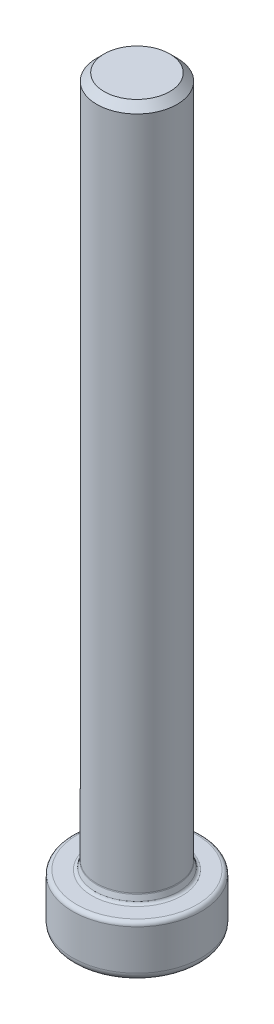
ISO-10303-21;
HEADER;
FILE_DESCRIPTION(('STEP AP214'),'2;1');
FILE_NAME('part.step','',(''),(''),'','','');
FILE_SCHEMA(('AUTOMOTIVE_DESIGN { 1 0 10303 214 1 1 1 1 }'));
ENDSEC;
DATA;
#1=APPLICATION_CONTEXT('core data for automotive mechanical design processes');
#2=APPLICATION_PROTOCOL_DEFINITION('international standard','automotive_design',2000,#1);
#3=PRODUCT_CONTEXT('',#1,'mechanical');
#4=PRODUCT('Part','Part','',(#3));
#5=PRODUCT_RELATED_PRODUCT_CATEGORY('part','',(#4));
#6=PRODUCT_DEFINITION_FORMATION('','',#4);
#7=PRODUCT_DEFINITION_CONTEXT('part definition',#1,'design');
#8=PRODUCT_DEFINITION('design','',#6,#7);
#9=PRODUCT_DEFINITION_SHAPE('','',#8);
#10=(LENGTH_UNIT() NAMED_UNIT(*) SI_UNIT(.MILLI.,.METRE.));
#11=(NAMED_UNIT(*) PLANE_ANGLE_UNIT() SI_UNIT($,.RADIAN.));
#12=(NAMED_UNIT(*) SI_UNIT($,.STERADIAN.) SOLID_ANGLE_UNIT());
#13=UNCERTAINTY_MEASURE_WITH_UNIT(LENGTH_MEASURE(1.E-05),#10,'distance_accuracy_value','');
#14=(GEOMETRIC_REPRESENTATION_CONTEXT(3) GLOBAL_UNCERTAINTY_ASSIGNED_CONTEXT((#13)) GLOBAL_UNIT_ASSIGNED_CONTEXT((#10,
#11,#12)) REPRESENTATION_CONTEXT('',''));
#15=CARTESIAN_POINT('',(0.,0.,0.));
#16=DIRECTION('',(0.,0.,1.));
#17=DIRECTION('',(1.,0.,0.));
#18=AXIS2_PLACEMENT_3D('',#15,#16,#17);
#19=CARTESIAN_POINT('',(-30.0499584026354,-27.5,-11.));
#20=DIRECTION('',(0.,1.,0.));
#21=DIRECTION('',(0.,0.,-1.));
#22=AXIS2_PLACEMENT_3D('',#19,#20,#21);
#23=CYLINDRICAL_SURFACE('',#22,5.);
#24=CARTESIAN_POINT('',(-30.0499584026354,12.58,-11.));
#25=DIRECTION('',(0.,1.,0.));
#26=DIRECTION('',(0.,0.,-1.));
#27=AXIS2_PLACEMENT_3D('',#24,#25,#26);
#28=CIRCLE('',#27,5.);
#29=CARTESIAN_POINT('',(-30.0499584026354,12.58,-16.));
#30=VERTEX_POINT('',#29);
#31=CARTESIAN_POINT('',(-30.0499584026355,12.58,-6.));
#32=VERTEX_POINT('',#31);
#33=EDGE_CURVE('E217',#30,#32,#28,.T.);
#34=ORIENTED_EDGE('',*,*,#33,.F.);
#35=CARTESIAN_POINT('',(-30.0499584026354,12.58,-11.));
#36=DIRECTION('',(0.,1.,0.));
#37=DIRECTION('',(0.,0.,-1.));
#38=AXIS2_PLACEMENT_3D('',#35,#36,#37);
#39=CIRCLE('',#38,5.);
#40=EDGE_CURVE('E228',#32,#30,#39,.T.);
#41=ORIENTED_EDGE('',*,*,#40,.F.);
#42=DIRECTION('',(0.,-1.,0.));
#43=VECTOR('',#42,1.);
#44=CARTESIAN_POINT('',(-30.0499584026354,-27.5,-6.));
#45=LINE('',#44,#43);
#46=CARTESIAN_POINT('',(-30.0499584026354,-71.48,-6.));
#47=VERTEX_POINT('',#46);
#48=EDGE_CURVE('E11',#32,#47,#45,.T.);
#49=ORIENTED_EDGE('',*,*,#48,.T.);
#50=CARTESIAN_POINT('',(-30.0499584026354,-71.48,-11.));
#51=DIRECTION('',(0.,-1.,0.));
#52=DIRECTION('',(0.,0.,-1.));
#53=AXIS2_PLACEMENT_3D('',#50,#51,#52);
#54=CIRCLE('',#53,5.);
#55=CARTESIAN_POINT('',(-25.0499584026354,-71.48,-11.));
#56=VERTEX_POINT('',#55);
#57=EDGE_CURVE('E302',#56,#47,#54,.T.);
#58=ORIENTED_EDGE('',*,*,#57,.F.);
#59=CARTESIAN_POINT('',(-30.0499584026354,-71.48,-11.));
#60=DIRECTION('',(0.,-1.,0.));
#61=DIRECTION('',(0.,0.,-1.));
#62=AXIS2_PLACEMENT_3D('',#59,#60,#61);
#63=CIRCLE('',#62,5.);
#64=EDGE_CURVE('E289',#47,#56,#63,.T.);
#65=ORIENTED_EDGE('',*,*,#64,.F.);
#66=ORIENTED_EDGE('',*,*,#48,.F.);
#67=EDGE_LOOP('',(#34,#41,#49,#58,#65,#66));
#68=FACE_BOUND('',#67,.T.);
#69=ADVANCED_FACE('F17',(#68),#23,.T.);
#70=CARTESIAN_POINT('',(-30.0499584026354,12.58,-11.));
#71=DIRECTION('',(0.,-1.,0.));
#72=DIRECTION('',(0.,0.,1.));
#73=AXIS2_PLACEMENT_3D('',#70,#71,#72);
#74=CONICAL_SURFACE('',#73,5.,0.78539816339745);
#75=ORIENTED_EDGE('',*,*,#33,.T.);
#76=ORIENTED_EDGE('',*,*,#40,.T.);
#77=DIRECTION('',(0.,0.707106781186546,0.707106781186549));
#78=VECTOR('',#77,1.);
#79=CARTESIAN_POINT('',(-30.0499584026354,12.58,-16.));
#80=LINE('',#79,#78);
#81=CARTESIAN_POINT('',(-30.0499584026354,13.5,-15.08));
#82=VERTEX_POINT('',#81);
#83=EDGE_CURVE('E25',#30,#82,#80,.T.);
#84=ORIENTED_EDGE('',*,*,#83,.T.);
#85=CARTESIAN_POINT('',(-30.0499584026354,13.5,-11.));
#86=DIRECTION('',(0.,1.,0.));
#87=DIRECTION('',(0.,0.,-1.));
#88=AXIS2_PLACEMENT_3D('',#85,#86,#87);
#89=CIRCLE('',#88,4.08);
#90=EDGE_CURVE('E214',#82,#82,#89,.T.);
#91=ORIENTED_EDGE('',*,*,#90,.F.);
#92=ORIENTED_EDGE('',*,*,#83,.F.);
#93=EDGE_LOOP('',(#75,#76,#84,#91,#92));
#94=FACE_BOUND('',#93,.T.);
#95=ADVANCED_FACE('F319',(#94),#74,.T.);
#96=CARTESIAN_POINT('',(-30.0499584026354,13.5,-15.08));
#97=DIRECTION('',(0.,-1.,0.));
#98=DIRECTION('',(0.,0.,-1.));
#99=AXIS2_PLACEMENT_3D('',#96,#97,#98);
#100=PLANE('',#99);
#101=ORIENTED_EDGE('',*,*,#90,.T.);
#102=EDGE_LOOP('',(#101));
#103=FACE_BOUND('',#102,.T.);
#104=ADVANCED_FACE('F321',(#103),#100,.F.);
#105=CARTESIAN_POINT('',(-30.0499584026354,-72.1,-11.));
#106=DIRECTION('',(0.,1.,0.));
#107=DIRECTION('',(-1.,0.,0.));
#108=AXIS2_PLACEMENT_3D('',#105,#106,#107);
#109=TOROIDAL_SURFACE('',#108,5.6,0.4);
#110=CARTESIAN_POINT('',(-30.0499584026354,-72.2228011119691,-11.));
#111=DIRECTION('',(0.,1.,0.));
#112=DIRECTION('',(-1.,0.,0.));
#113=AXIS2_PLACEMENT_3D('',#110,#111,#112);
#114=CIRCLE('',#113,5.21931655289578);
#115=CARTESIAN_POINT('',(-35.2692749555312,-72.2228011119691,-11.));
#116=VERTEX_POINT('',#115);
#117=CARTESIAN_POINT('',(-24.8306418497397,-72.2228011119691,-11.));
#118=VERTEX_POINT('',#117);
#119=EDGE_CURVE('E306',#116,#118,#114,.T.);
#120=ORIENTED_EDGE('',*,*,#119,.F.);
#121=CARTESIAN_POINT('',(-30.0499584026354,-72.2228011119691,-11.));
#122=DIRECTION('',(0.,1.,0.));
#123=DIRECTION('',(-1.,0.,0.));
#124=AXIS2_PLACEMENT_3D('',#121,#122,#123);
#125=CIRCLE('',#124,5.21931655289578);
#126=EDGE_CURVE('E310',#118,#116,#125,.T.);
#127=ORIENTED_EDGE('',*,*,#126,.F.);
#128=CARTESIAN_POINT('',(-24.4499584026354,-72.1,-11.));
#129=DIRECTION('',(0.,0.,1.));
#130=DIRECTION('',(1.,0.,0.));
#131=AXIS2_PLACEMENT_3D('',#128,#129,#130);
#132=CIRCLE('',#131,0.4);
#133=CARTESIAN_POINT('',(-24.4499584026354,-72.5,-11.));
#134=VERTEX_POINT('',#133);
#135=EDGE_CURVE('E218',#118,#134,#132,.T.);
#136=ORIENTED_EDGE('',*,*,#135,.T.);
#137=CARTESIAN_POINT('',(-30.0499584026354,-72.5,-11.));
#138=DIRECTION('',(0.,-1.,0.));
#139=DIRECTION('',(0.,0.,1.));
#140=AXIS2_PLACEMENT_3D('',#137,#138,#139);
#141=CIRCLE('',#140,5.6);
#142=EDGE_CURVE('E393',#134,#134,#141,.T.);
#143=ORIENTED_EDGE('',*,*,#142,.F.);
#144=ORIENTED_EDGE('',*,*,#135,.F.);
#145=EDGE_LOOP('',(#120,#127,#136,#143,#144));
#146=FACE_BOUND('',#145,.T.);
#147=ADVANCED_FACE('F323',(#146),#109,.F.);
#148=CARTESIAN_POINT('',(-30.0499584026354,-71.6028011119691,-11.));
#149=DIRECTION('',(0.,-1.,0.));
#150=DIRECTION('',(1.,0.,0.));
#151=AXIS2_PLACEMENT_3D('',#148,#149,#150);
#152=CONICAL_SURFACE('',#151,5.01931655289578,0.312042121562536);
#153=ORIENTED_EDGE('',*,*,#119,.T.);
#154=ORIENTED_EDGE('',*,*,#126,.T.);
#155=DIRECTION('',(0.307002779922761,0.95170861776055,0.));
#156=VECTOR('',#155,1.);
#157=CARTESIAN_POINT('',(-35.0692749555312,-71.6028011119691,-11.));
#158=LINE('',#157,#156);
#159=CARTESIAN_POINT('',(-35.0692749555312,-71.6028011119691,-11.));
#160=VERTEX_POINT('',#159);
#161=EDGE_CURVE('E251',#116,#160,#158,.T.);
#162=ORIENTED_EDGE('',*,*,#161,.T.);
#163=CARTESIAN_POINT('',(-30.0499584026354,-71.6028011119691,-11.));
#164=DIRECTION('',(0.,1.,0.));
#165=DIRECTION('',(-1.,0.,0.));
#166=AXIS2_PLACEMENT_3D('',#163,#164,#165);
#167=CIRCLE('',#166,5.01931655289578);
#168=CARTESIAN_POINT('',(-25.0306418497397,-71.6028011119691,-11.));
#169=VERTEX_POINT('',#168);
#170=EDGE_CURVE('E295',#169,#160,#167,.T.);
#171=ORIENTED_EDGE('',*,*,#170,.F.);
#172=CARTESIAN_POINT('',(-30.0499584026354,-71.6028011119691,-11.));
#173=DIRECTION('',(0.,1.,0.));
#174=DIRECTION('',(-1.,0.,0.));
#175=AXIS2_PLACEMENT_3D('',#172,#173,#174);
#176=CIRCLE('',#175,5.01931655289578);
#177=EDGE_CURVE('E299',#160,#169,#176,.T.);
#178=ORIENTED_EDGE('',*,*,#177,.F.);
#179=ORIENTED_EDGE('',*,*,#161,.F.);
#180=EDGE_LOOP('',(#153,#154,#162,#171,#178,#179));
#181=FACE_BOUND('',#180,.T.);
#182=ADVANCED_FACE('F330',(#181),#152,.T.);
#183=CARTESIAN_POINT('',(-30.0499584026354,-71.48,-11.));
#184=DIRECTION('',(0.,1.,0.));
#185=DIRECTION('',(-1.,0.,0.));
#186=AXIS2_PLACEMENT_3D('',#183,#184,#185);
#187=TOROIDAL_SURFACE('',#186,5.4,0.4);
#188=ORIENTED_EDGE('',*,*,#64,.T.);
#189=CARTESIAN_POINT('',(-24.6499584026354,-71.48,-11.));
#190=DIRECTION('',(0.,0.,1.));
#191=DIRECTION('',(1.,0.,0.));
#192=AXIS2_PLACEMENT_3D('',#189,#190,#191);
#193=CIRCLE('',#192,0.4);
#194=EDGE_CURVE('E294',#56,#169,#193,.T.);
#195=ORIENTED_EDGE('',*,*,#194,.T.);
#196=ORIENTED_EDGE('',*,*,#170,.T.);
#197=ORIENTED_EDGE('',*,*,#177,.T.);
#198=ORIENTED_EDGE('',*,*,#194,.F.);
#199=ORIENTED_EDGE('',*,*,#57,.T.);
#200=EDGE_LOOP('',(#188,#195,#196,#197,#198,#199));
#201=FACE_BOUND('',#200,.T.);
#202=ADVANCED_FACE('F338',(#201),#187,.F.);
#203=CARTESIAN_POINT('',(-30.0499584026354,-75.5,-11.));
#204=DIRECTION('',(0.,-1.,0.));
#205=DIRECTION('',(0.,0.,1.));
#206=AXIS2_PLACEMENT_3D('',#203,#204,#205);
#207=CONICAL_SURFACE('',#206,4.,1.0471975511966);
#208=CARTESIAN_POINT('',(-30.0499584026354,-74.6339745962156,-11.));
#209=DIRECTION('',(0.,1.,0.));
#210=DIRECTION('',(0.,0.,-1.));
#211=AXIS2_PLACEMENT_3D('',#208,#209,#210);
#212=CIRCLE('',#211,2.5);
#213=CARTESIAN_POINT('',(-30.0499584026354,-74.6339745962156,-13.5));
#214=VERTEX_POINT('',#213);
#215=CARTESIAN_POINT('',(-30.0499584026354,-74.6339745962156,-8.5));
#216=VERTEX_POINT('',#215);
#217=EDGE_CURVE('E281',#214,#216,#212,.T.);
#218=ORIENTED_EDGE('',*,*,#217,.T.);
#219=CARTESIAN_POINT('',(-30.0499584026354,-74.6339745962156,-11.));
#220=DIRECTION('',(0.,1.,0.));
#221=DIRECTION('',(0.,0.,-1.));
#222=AXIS2_PLACEMENT_3D('',#219,#220,#221);
#223=CIRCLE('',#222,2.5);
#224=EDGE_CURVE('E285',#216,#214,#223,.T.);
#225=ORIENTED_EDGE('',*,*,#224,.T.);
#226=DIRECTION('',(0.,-0.5,-0.86602540378444));
#227=VECTOR('',#226,1.);
#228=CARTESIAN_POINT('',(-30.0499584026354,-75.5,-15.));
#229=LINE('',#228,#227);
#230=CARTESIAN_POINT('',(-30.0499584026354,-75.5,-15.));
#231=VERTEX_POINT('',#230);
#232=EDGE_CURVE('E286',#214,#231,#229,.T.);
#233=ORIENTED_EDGE('',*,*,#232,.T.);
#234=CARTESIAN_POINT('',(-30.0499584026354,-75.5,-11.));
#235=DIRECTION('',(0.,1.,0.));
#236=DIRECTION('',(-1.,0.,0.));
#237=AXIS2_PLACEMENT_3D('',#234,#235,#236);
#238=CIRCLE('',#237,4.);
#239=CARTESIAN_POINT('',(-26.5858567874977,-75.5,-13.));
#240=VERTEX_POINT('',#239);
#241=EDGE_CURVE('E256',#240,#231,#238,.T.);
#242=ORIENTED_EDGE('',*,*,#241,.F.);
#243=CARTESIAN_POINT('',(-30.0499584026354,-75.5,-11.));
#244=DIRECTION('',(0.,1.,0.));
#245=DIRECTION('',(-1.,0.,0.));
#246=AXIS2_PLACEMENT_3D('',#243,#244,#245);
#247=CIRCLE('',#246,4.);
#248=CARTESIAN_POINT('',(-26.5858567874977,-75.5,-9.));
#249=VERTEX_POINT('',#248);
#250=EDGE_CURVE('E186',#249,#240,#247,.T.);
#251=ORIENTED_EDGE('',*,*,#250,.F.);
#252=CARTESIAN_POINT('',(-30.0499584026354,-75.5,-11.));
#253=DIRECTION('',(0.,1.,0.));
#254=DIRECTION('',(-1.,0.,0.));
#255=AXIS2_PLACEMENT_3D('',#252,#253,#254);
#256=CIRCLE('',#255,4.);
#257=CARTESIAN_POINT('',(-30.0499584026354,-75.5,-7.));
#258=VERTEX_POINT('',#257);
#259=EDGE_CURVE('E275',#258,#249,#256,.T.);
#260=ORIENTED_EDGE('',*,*,#259,.F.);
#261=CARTESIAN_POINT('',(-30.0499584026354,-75.5,-11.));
#262=DIRECTION('',(0.,1.,0.));
#263=DIRECTION('',(-1.,0.,0.));
#264=AXIS2_PLACEMENT_3D('',#261,#262,#263);
#265=CIRCLE('',#264,4.);
#266=CARTESIAN_POINT('',(-33.5140600177732,-75.5,-9.));
#267=VERTEX_POINT('',#266);
#268=EDGE_CURVE('E271',#267,#258,#265,.T.);
#269=ORIENTED_EDGE('',*,*,#268,.F.);
#270=CARTESIAN_POINT('',(-30.0499584026354,-75.5,-11.));
#271=DIRECTION('',(0.,1.,0.));
#272=DIRECTION('',(-1.,0.,0.));
#273=AXIS2_PLACEMENT_3D('',#270,#271,#272);
#274=CIRCLE('',#273,4.);
#275=CARTESIAN_POINT('',(-33.5140600177732,-75.5,-13.));
#276=VERTEX_POINT('',#275);
#277=EDGE_CURVE('E267',#276,#267,#274,.T.);
#278=ORIENTED_EDGE('',*,*,#277,.F.);
#279=CARTESIAN_POINT('',(-30.0499584026354,-75.5,-11.));
#280=DIRECTION('',(0.,1.,0.));
#281=DIRECTION('',(-1.,0.,0.));
#282=AXIS2_PLACEMENT_3D('',#279,#280,#281);
#283=CIRCLE('',#282,4.);
#284=EDGE_CURVE('E263',#231,#276,#283,.T.);
#285=ORIENTED_EDGE('',*,*,#284,.F.);
#286=ORIENTED_EDGE('',*,*,#232,.F.);
#287=EDGE_LOOP('',(#218,#225,#233,#242,#251,#260,#269,#278,#285,#286));
#288=FACE_BOUND('',#287,.T.);
#289=ADVANCED_FACE('F511',(#288),#207,.F.);
#290=CARTESIAN_POINT('',(-30.0499584026354,-71.5,-11.));
#291=DIRECTION('',(0.,1.,0.));
#292=DIRECTION('',(0.,0.,-1.));
#293=AXIS2_PLACEMENT_3D('',#290,#291,#292);
#294=CYLINDRICAL_SURFACE('',#293,2.5);
#295=ORIENTED_EDGE('',*,*,#217,.F.);
#296=ORIENTED_EDGE('',*,*,#224,.F.);
#297=DIRECTION('',(0.,1.,0.));
#298=VECTOR('',#297,1.);
#299=CARTESIAN_POINT('',(-30.0499584026354,-71.5,-8.5));
#300=LINE('',#299,#298);
#301=CARTESIAN_POINT('',(-30.0499584026354,-71.5,-8.5));
#302=VERTEX_POINT('',#301);
#303=EDGE_CURVE('E290',#216,#302,#300,.T.);
#304=ORIENTED_EDGE('',*,*,#303,.T.);
#305=CARTESIAN_POINT('',(-30.0499584026354,-71.5,-11.));
#306=DIRECTION('',(0.,1.,0.));
#307=DIRECTION('',(0.,0.,-1.));
#308=AXIS2_PLACEMENT_3D('',#305,#306,#307);
#309=CIRCLE('',#308,2.5);
#310=EDGE_CURVE('E260',#302,#302,#309,.T.);
#311=ORIENTED_EDGE('',*,*,#310,.T.);
#312=ORIENTED_EDGE('',*,*,#303,.F.);
#313=EDGE_LOOP('',(#295,#296,#304,#311,#312));
#314=FACE_BOUND('',#313,.T.);
#315=ADVANCED_FACE('F585',(#314),#294,.F.);
#316=CARTESIAN_POINT('',(-32.5499584026354,-71.5,-11.));
#317=DIRECTION('',(0.,-1.,0.));
#318=DIRECTION('',(0.,0.,-1.));
#319=AXIS2_PLACEMENT_3D('',#316,#317,#318);
#320=PLANE('',#319);
#321=ORIENTED_EDGE('',*,*,#310,.F.);
#322=EDGE_LOOP('',(#321));
#323=FACE_BOUND('',#322,.T.);
#324=ADVANCED_FACE('F582',(#323),#320,.T.);
#325=CARTESIAN_POINT('',(-30.0499584026354,-75.5,-11.));
#326=DIRECTION('',(0.,1.,0.));
#327=DIRECTION('',(1.,0.,0.));
#328=AXIS2_PLACEMENT_3D('',#325,#326,#327);
#329=PLANE('',#328);
#330=ORIENTED_EDGE('',*,*,#241,.T.);
#331=DIRECTION('',(-1.,0.,0.));
#332=VECTOR('',#331,1.);
#333=CARTESIAN_POINT('',(-27.7405573258769,-75.5,-15.));
#334=LINE('',#333,#332);
#335=CARTESIAN_POINT('',(-27.7405573258769,-75.5,-15.));
#336=VERTEX_POINT('',#335);
#337=EDGE_CURVE('E220',#336,#231,#334,.T.);
#338=ORIENTED_EDGE('',*,*,#337,.F.);
#339=DIRECTION('',(-0.5,0.,-0.866025403784439));
#340=VECTOR('',#339,1.);
#341=CARTESIAN_POINT('',(-25.4311562491184,-75.5,-11.));
#342=LINE('',#341,#340);
#343=EDGE_CURVE('E191',#240,#336,#342,.T.);
#344=ORIENTED_EDGE('',*,*,#343,.F.);
#345=EDGE_LOOP('',(#330,#338,#344));
#346=FACE_BOUND('',#345,.T.);
#347=ADVANCED_FACE('F514',(#346),#329,.F.);
#348=CARTESIAN_POINT('',(-30.0499584026354,-75.5,-11.));
#349=DIRECTION('',(0.,1.,0.));
#350=DIRECTION('',(1.,0.,0.));
#351=AXIS2_PLACEMENT_3D('',#348,#349,#350);
#352=PLANE('',#351);
#353=ORIENTED_EDGE('',*,*,#250,.T.);
#354=DIRECTION('',(-0.5,0.,-0.866025403784439));
#355=VECTOR('',#354,1.);
#356=CARTESIAN_POINT('',(-25.4311562491184,-75.5,-11.));
#357=LINE('',#356,#355);
#358=CARTESIAN_POINT('',(-25.4311562491184,-75.5,-11.));
#359=VERTEX_POINT('',#358);
#360=EDGE_CURVE('E180',#359,#240,#357,.T.);
#361=ORIENTED_EDGE('',*,*,#360,.F.);
#362=DIRECTION('',(0.5,0.,-0.866025403784439));
#363=VECTOR('',#362,1.);
#364=CARTESIAN_POINT('',(-27.7405573258769,-75.5,-7.));
#365=LINE('',#364,#363);
#366=EDGE_CURVE('E184',#249,#359,#365,.T.);
#367=ORIENTED_EDGE('',*,*,#366,.F.);
#368=EDGE_LOOP('',(#353,#361,#367));
#369=FACE_BOUND('',#368,.T.);
#370=ADVANCED_FACE('F182',(#369),#352,.F.);
#371=CARTESIAN_POINT('',(-30.0499584026354,-75.5,-11.));
#372=DIRECTION('',(0.,1.,0.));
#373=DIRECTION('',(1.,0.,0.));
#374=AXIS2_PLACEMENT_3D('',#371,#372,#373);
#375=PLANE('',#374);
#376=ORIENTED_EDGE('',*,*,#259,.T.);
#377=DIRECTION('',(0.5,0.,-0.866025403784439));
#378=VECTOR('',#377,1.);
#379=CARTESIAN_POINT('',(-27.7405573258769,-75.5,-7.));
#380=LINE('',#379,#378);
#381=CARTESIAN_POINT('',(-27.7405573258769,-75.5,-7.));
#382=VERTEX_POINT('',#381);
#383=EDGE_CURVE('E205',#382,#249,#380,.T.);
#384=ORIENTED_EDGE('',*,*,#383,.F.);
#385=DIRECTION('',(1.,0.,0.));
#386=VECTOR('',#385,1.);
#387=CARTESIAN_POINT('',(-32.3593594793939,-75.5,-7.));
#388=LINE('',#387,#386);
#389=EDGE_CURVE('E462',#258,#382,#388,.T.);
#390=ORIENTED_EDGE('',*,*,#389,.F.);
#391=EDGE_LOOP('',(#376,#384,#390));
#392=FACE_BOUND('',#391,.T.);
#393=ADVANCED_FACE('F510',(#392),#375,.F.);
#394=CARTESIAN_POINT('',(-30.0499584026354,-75.5,-11.));
#395=DIRECTION('',(0.,1.,0.));
#396=DIRECTION('',(1.,0.,0.));
#397=AXIS2_PLACEMENT_3D('',#394,#395,#396);
#398=PLANE('',#397);
#399=ORIENTED_EDGE('',*,*,#268,.T.);
#400=DIRECTION('',(1.,0.,0.));
#401=VECTOR('',#400,1.);
#402=CARTESIAN_POINT('',(-32.3593594793939,-75.5,-7.));
#403=LINE('',#402,#401);
#404=CARTESIAN_POINT('',(-32.3593594793939,-75.5,-7.));
#405=VERTEX_POINT('',#404);
#406=EDGE_CURVE('E458',#405,#258,#403,.T.);
#407=ORIENTED_EDGE('',*,*,#406,.F.);
#408=DIRECTION('',(0.5,0.,0.866025403784439));
#409=VECTOR('',#408,1.);
#410=CARTESIAN_POINT('',(-34.6687605561524,-75.5,-11.));
#411=LINE('',#410,#409);
#412=EDGE_CURVE('E255',#267,#405,#411,.T.);
#413=ORIENTED_EDGE('',*,*,#412,.F.);
#414=EDGE_LOOP('',(#399,#407,#413));
#415=FACE_BOUND('',#414,.T.);
#416=ADVANCED_FACE('F507',(#415),#398,.F.);
#417=CARTESIAN_POINT('',(-30.0499584026354,-75.5,-11.));
#418=DIRECTION('',(0.,1.,0.));
#419=DIRECTION('',(1.,0.,0.));
#420=AXIS2_PLACEMENT_3D('',#417,#418,#419);
#421=PLANE('',#420);
#422=DIRECTION('',(-0.5,0.,0.866025403784439));
#423=VECTOR('',#422,1.);
#424=CARTESIAN_POINT('',(-32.3593594793939,-75.5,-15.));
#425=LINE('',#424,#423);
#426=CARTESIAN_POINT('',(-34.6687605561524,-75.5,-11.));
#427=VERTEX_POINT('',#426);
#428=EDGE_CURVE('E241',#276,#427,#425,.T.);
#429=ORIENTED_EDGE('',*,*,#428,.F.);
#430=ORIENTED_EDGE('',*,*,#277,.T.);
#431=DIRECTION('',(0.5,0.,0.866025403784439));
#432=VECTOR('',#431,1.);
#433=CARTESIAN_POINT('',(-34.6687605561524,-75.5,-11.));
#434=LINE('',#433,#432);
#435=EDGE_CURVE('E248',#427,#267,#434,.T.);
#436=ORIENTED_EDGE('',*,*,#435,.F.);
#437=EDGE_LOOP('',(#429,#430,#436));
#438=FACE_BOUND('',#437,.T.);
#439=ADVANCED_FACE('F568',(#438),#421,.F.);
#440=CARTESIAN_POINT('',(-30.0499584026354,-75.5,-11.));
#441=DIRECTION('',(0.,1.,0.));
#442=DIRECTION('',(1.,0.,0.));
#443=AXIS2_PLACEMENT_3D('',#440,#441,#442);
#444=PLANE('',#443);
#445=ORIENTED_EDGE('',*,*,#284,.T.);
#446=DIRECTION('',(-0.5,0.,0.866025403784439));
#447=VECTOR('',#446,1.);
#448=CARTESIAN_POINT('',(-32.3593594793939,-75.5,-15.));
#449=LINE('',#448,#447);
#450=CARTESIAN_POINT('',(-32.3593594793939,-75.5,-15.));
#451=VERTEX_POINT('',#450);
#452=EDGE_CURVE('E237',#451,#276,#449,.T.);
#453=ORIENTED_EDGE('',*,*,#452,.F.);
#454=DIRECTION('',(-1.,0.,0.));
#455=VECTOR('',#454,1.);
#456=CARTESIAN_POINT('',(-27.7405573258769,-75.5,-15.));
#457=LINE('',#456,#455);
#458=EDGE_CURVE('E224',#231,#451,#457,.T.);
#459=ORIENTED_EDGE('',*,*,#458,.F.);
#460=EDGE_LOOP('',(#445,#453,#459));
#461=FACE_BOUND('',#460,.T.);
#462=ADVANCED_FACE('F518',(#461),#444,.F.);
#463=CARTESIAN_POINT('',(-34.6687605561524,-75.5,-11.));
#464=DIRECTION('',(0.866025403784439,0.,-0.5));
#465=DIRECTION('',(0.,-1.,0.));
#466=AXIS2_PLACEMENT_3D('',#463,#464,#465);
#467=PLANE('',#466);
#468=DIRECTION('',(0.,-1.,0.));
#469=VECTOR('',#468,1.);
#470=CARTESIAN_POINT('',(-34.6687605561524,-75.5,-11.));
#471=LINE('',#470,#469);
#472=CARTESIAN_POINT('',(-34.6687605561524,-79.,-11.));
#473=VERTEX_POINT('',#472);
#474=EDGE_CURVE('E245',#427,#473,#471,.T.);
#475=ORIENTED_EDGE('',*,*,#474,.F.);
#476=ORIENTED_EDGE('',*,*,#435,.T.);
#477=ORIENTED_EDGE('',*,*,#412,.T.);
#478=DIRECTION('',(0.,-1.,0.));
#479=VECTOR('',#478,1.);
#480=CARTESIAN_POINT('',(-32.3593594793939,-75.5,-7.));
#481=LINE('',#480,#479);
#482=CARTESIAN_POINT('',(-32.3593594793939,-79.,-7.));
#483=VERTEX_POINT('',#482);
#484=EDGE_CURVE('E446',#405,#483,#481,.T.);
#485=ORIENTED_EDGE('',*,*,#484,.T.);
#486=CARTESIAN_POINT('',(-34.6687605561524,-79.,-11.));
#487=CARTESIAN_POINT('',(-33.5140600177732,-77.8452994616206,-9.00000000000001));
#488=CARTESIAN_POINT('',(-32.3593594793939,-79.,-7.));
#489=(BOUNDED_CURVE() B_SPLINE_CURVE(2,(#486,#487,#488),.UNSPECIFIED.,.F.,
.F.) B_SPLINE_CURVE_WITH_KNOTS((3,3),(-0.705094379751374,-0.147934530722328),
.UNSPECIFIED.) CURVE() GEOMETRIC_REPRESENTATION_ITEM() RATIONAL_B_SPLINE_CURVE((1.11602540378444,
1.28867513459481,1.11602540378444)) REPRESENTATION_ITEM(''));
#490=EDGE_CURVE('E402',#473,#483,#489,.T.);
#491=ORIENTED_EDGE('',*,*,#490,.F.);
#492=EDGE_LOOP('',(#475,#476,#477,#485,#491));
#493=FACE_BOUND('',#492,.T.);
#494=ADVANCED_FACE('F503',(#493),#467,.T.);
#495=CARTESIAN_POINT('',(-32.3593594793939,-75.5,-15.));
#496=DIRECTION('',(0.866025403784439,0.,0.5));
#497=DIRECTION('',(0.,-1.,0.));
#498=AXIS2_PLACEMENT_3D('',#495,#496,#497);
#499=PLANE('',#498);
#500=DIRECTION('',(0.,-1.,0.));
#501=VECTOR('',#500,1.);
#502=CARTESIAN_POINT('',(-32.3593594793939,-75.5,-15.));
#503=LINE('',#502,#501);
#504=CARTESIAN_POINT('',(-32.3593594793939,-79.,-15.));
#505=VERTEX_POINT('',#504);
#506=EDGE_CURVE('E234',#451,#505,#503,.T.);
#507=ORIENTED_EDGE('',*,*,#506,.F.);
#508=ORIENTED_EDGE('',*,*,#452,.T.);
#509=ORIENTED_EDGE('',*,*,#428,.T.);
#510=ORIENTED_EDGE('',*,*,#474,.T.);
#511=CARTESIAN_POINT('',(-32.3593594793939,-79.,-15.));
#512=CARTESIAN_POINT('',(-33.5140600177732,-77.8452994616206,-13.));
#513=CARTESIAN_POINT('',(-34.6687605561524,-79.,-11.));
#514=(BOUNDED_CURVE() B_SPLINE_CURVE(2,(#511,#512,#513),.UNSPECIFIED.,.F.,
.F.) B_SPLINE_CURVE_WITH_KNOTS((3,3),(-0.705094379751375,-0.147934530722328),
.UNSPECIFIED.) CURVE() GEOMETRIC_REPRESENTATION_ITEM() RATIONAL_B_SPLINE_CURVE((1.11602540378444,
1.28867513459482,1.11602540378444)) REPRESENTATION_ITEM(''));
#515=EDGE_CURVE('E423',#505,#473,#514,.T.);
#516=ORIENTED_EDGE('',*,*,#515,.F.);
#517=EDGE_LOOP('',(#507,#508,#509,#510,#516));
#518=FACE_BOUND('',#517,.T.);
#519=ADVANCED_FACE('F499',(#518),#499,.T.);
#520=CARTESIAN_POINT('',(-27.7405573258769,-75.5,-15.));
#521=DIRECTION('',(0.,0.,1.));
#522=DIRECTION('',(1.,0.,0.));
#523=AXIS2_PLACEMENT_3D('',#520,#521,#522);
#524=PLANE('',#523);
#525=DIRECTION('',(0.,-1.,0.));
#526=VECTOR('',#525,1.);
#527=CARTESIAN_POINT('',(-27.7405573258769,-75.5,-15.));
#528=LINE('',#527,#526);
#529=CARTESIAN_POINT('',(-27.7405573258769,-79.,-15.));
#530=VERTEX_POINT('',#529);
#531=EDGE_CURVE('E225',#336,#530,#528,.T.);
#532=ORIENTED_EDGE('',*,*,#531,.F.);
#533=ORIENTED_EDGE('',*,*,#337,.T.);
#534=ORIENTED_EDGE('',*,*,#458,.T.);
#535=ORIENTED_EDGE('',*,*,#506,.T.);
#536=CARTESIAN_POINT('',(-27.7405573258769,-79.,-15.));
#537=CARTESIAN_POINT('',(-30.0499584026354,-77.8452994616206,-15.));
#538=CARTESIAN_POINT('',(-32.3593594793939,-79.,-15.));
#539=(BOUNDED_CURVE() B_SPLINE_CURVE(2,(#536,#537,#538),.UNSPECIFIED.,.F.,
.F.) B_SPLINE_CURVE_WITH_KNOTS((3,3),(-0.705094379751374,-0.147934530722328),
.UNSPECIFIED.) CURVE() GEOMETRIC_REPRESENTATION_ITEM() RATIONAL_B_SPLINE_CURVE((1.11602540378444,
1.28867513459482,1.11602540378444)) REPRESENTATION_ITEM(''));
#540=EDGE_CURVE('E370',#530,#505,#539,.T.);
#541=ORIENTED_EDGE('',*,*,#540,.F.);
#542=EDGE_LOOP('',(#532,#533,#534,#535,#541));
#543=FACE_BOUND('',#542,.T.);
#544=ADVANCED_FACE('F520',(#543),#524,.T.);
#545=CARTESIAN_POINT('',(-25.4311562491184,-75.5,-11.));
#546=DIRECTION('',(-0.866025403784439,0.,0.5));
#547=DIRECTION('',(0.,1.,0.));
#548=AXIS2_PLACEMENT_3D('',#545,#546,#547);
#549=PLANE('',#548);
#550=DIRECTION('',(0.,-1.,0.));
#551=VECTOR('',#550,1.);
#552=CARTESIAN_POINT('',(-25.4311562491184,-75.5,-11.));
#553=LINE('',#552,#551);
#554=CARTESIAN_POINT('',(-25.4311562491184,-79.,-11.));
#555=VERTEX_POINT('',#554);
#556=EDGE_CURVE('E192',#359,#555,#553,.T.);
#557=ORIENTED_EDGE('',*,*,#556,.F.);
#558=ORIENTED_EDGE('',*,*,#360,.T.);
#559=ORIENTED_EDGE('',*,*,#343,.T.);
#560=ORIENTED_EDGE('',*,*,#531,.T.);
#561=CARTESIAN_POINT('',(-25.4311562491184,-79.,-11.));
#562=CARTESIAN_POINT('',(-26.5858567874977,-77.8452994616206,-13.));
#563=CARTESIAN_POINT('',(-27.7405573258769,-79.,-15.));
#564=(BOUNDED_CURVE() B_SPLINE_CURVE(2,(#561,#562,#563),.UNSPECIFIED.,.F.,
.F.) B_SPLINE_CURVE_WITH_KNOTS((3,3),(-0.705094379751373,-0.147934530722327),
.UNSPECIFIED.) CURVE() GEOMETRIC_REPRESENTATION_ITEM() RATIONAL_B_SPLINE_CURVE((1.11602540378444,
1.28867513459481,1.11602540378444)) REPRESENTATION_ITEM(''));
#565=EDGE_CURVE('E197',#555,#530,#564,.T.);
#566=ORIENTED_EDGE('',*,*,#565,.F.);
#567=EDGE_LOOP('',(#557,#558,#559,#560,#566));
#568=FACE_BOUND('',#567,.T.);
#569=ADVANCED_FACE('F195',(#568),#549,.T.);
#570=CARTESIAN_POINT('',(-27.7405573258769,-75.5,-7.));
#571=DIRECTION('',(-0.866025403784439,0.,-0.5));
#572=DIRECTION('',(-0.5,0.,0.866025403784439));
#573=AXIS2_PLACEMENT_3D('',#570,#571,#572);
#574=PLANE('',#573);
#575=DIRECTION('',(0.,-1.,0.));
#576=VECTOR('',#575,1.);
#577=CARTESIAN_POINT('',(-27.7405573258769,-75.5,-7.));
#578=LINE('',#577,#576);
#579=CARTESIAN_POINT('',(-27.7405573258769,-79.,-7.));
#580=VERTEX_POINT('',#579);
#581=EDGE_CURVE('E210',#382,#580,#578,.T.);
#582=ORIENTED_EDGE('',*,*,#581,.F.);
#583=ORIENTED_EDGE('',*,*,#383,.T.);
#584=ORIENTED_EDGE('',*,*,#366,.T.);
#585=ORIENTED_EDGE('',*,*,#556,.T.);
#586=CARTESIAN_POINT('',(-27.7405573258769,-79.,-7.));
#587=CARTESIAN_POINT('',(-26.5858567874977,-77.8452994616206,-9.));
#588=CARTESIAN_POINT('',(-25.4311562491184,-79.,-11.));
#589=(BOUNDED_CURVE() B_SPLINE_CURVE(2,(#586,#587,#588),.UNSPECIFIED.,.F.,
.F.) B_SPLINE_CURVE_WITH_KNOTS((3,3),(-0.705094379751374,-0.147934530722328),
.UNSPECIFIED.) CURVE() GEOMETRIC_REPRESENTATION_ITEM() RATIONAL_B_SPLINE_CURVE((1.11602540378444,
1.28867513459482,1.11602540378444)) REPRESENTATION_ITEM(''));
#590=EDGE_CURVE('E360',#580,#555,#589,.T.);
#591=ORIENTED_EDGE('',*,*,#590,.F.);
#592=EDGE_LOOP('',(#582,#583,#584,#585,#591));
#593=FACE_BOUND('',#592,.T.);
#594=ADVANCED_FACE('F204',(#593),#574,.T.);
#595=CARTESIAN_POINT('',(-32.3593594793939,-75.5,-7.));
#596=DIRECTION('',(0.,0.,-1.));
#597=DIRECTION('',(0.,-1.,0.));
#598=AXIS2_PLACEMENT_3D('',#595,#596,#597);
#599=PLANE('',#598);
#600=ORIENTED_EDGE('',*,*,#484,.F.);
#601=ORIENTED_EDGE('',*,*,#406,.T.);
#602=ORIENTED_EDGE('',*,*,#389,.T.);
#603=ORIENTED_EDGE('',*,*,#581,.T.);
#604=CARTESIAN_POINT('',(-32.359359479394,-79.,-7.));
#605=CARTESIAN_POINT('',(-30.0499584026354,-77.8452994616206,-7.));
#606=CARTESIAN_POINT('',(-27.7405573258769,-79.,-7.));
#607=(BOUNDED_CURVE() B_SPLINE_CURVE(2,(#604,#605,#606),.UNSPECIFIED.,.F.,
.F.) B_SPLINE_CURVE_WITH_KNOTS((3,3),(-0.705094379751374,-0.147934530722328),
.UNSPECIFIED.) CURVE() GEOMETRIC_REPRESENTATION_ITEM() RATIONAL_B_SPLINE_CURVE((1.11602540378444,
1.28867513459481,1.11602540378444)) REPRESENTATION_ITEM(''));
#608=EDGE_CURVE('E361',#483,#580,#607,.T.);
#609=ORIENTED_EDGE('',*,*,#608,.F.);
#610=EDGE_LOOP('',(#600,#601,#602,#603,#609));
#611=FACE_BOUND('',#610,.T.);
#612=ADVANCED_FACE('F470',(#611),#599,.T.);
#613=CARTESIAN_POINT('',(-30.0499584026354,-79.,-11.));
#614=DIRECTION('',(0.,1.,0.));
#615=DIRECTION('',(1.,0.,0.));
#616=AXIS2_PLACEMENT_3D('',#613,#614,#615);
#617=PLANE('',#616);
#618=CARTESIAN_POINT('',(-30.0499584026354,-79.,-11.));
#619=DIRECTION('',(0.,-1.,0.));
#620=DIRECTION('',(0.,0.,-1.));
#621=AXIS2_PLACEMENT_3D('',#618,#619,#620);
#622=CIRCLE('',#621,4.61880215351701);
#623=EDGE_CURVE('E376',#473,#505,#622,.T.);
#624=ORIENTED_EDGE('',*,*,#623,.F.);
#625=CARTESIAN_POINT('',(-30.0499584026354,-79.,-11.));
#626=DIRECTION('',(0.,1.,0.));
#627=DIRECTION('',(-1.,0.,0.));
#628=AXIS2_PLACEMENT_3D('',#625,#626,#627);
#629=CIRCLE('',#628,4.61880215351701);
#630=EDGE_CURVE('E411',#473,#483,#629,.T.);
#631=ORIENTED_EDGE('',*,*,#630,.T.);
#632=CARTESIAN_POINT('',(-30.0499584026354,-79.,-11.));
#633=DIRECTION('',(0.,1.,0.));
#634=DIRECTION('',(-1.,0.,0.));
#635=AXIS2_PLACEMENT_3D('',#632,#633,#634);
#636=CIRCLE('',#635,4.61880215351701);
#637=EDGE_CURVE('E349',#483,#580,#636,.T.);
#638=ORIENTED_EDGE('',*,*,#637,.T.);
#639=CARTESIAN_POINT('',(-30.0499584026354,-79.,-11.));
#640=DIRECTION('',(0.,1.,0.));
#641=DIRECTION('',(-1.,0.,0.));
#642=AXIS2_PLACEMENT_3D('',#639,#640,#641);
#643=CIRCLE('',#642,4.61880215351701);
#644=EDGE_CURVE('E356',#580,#555,#643,.T.);
#645=ORIENTED_EDGE('',*,*,#644,.T.);
#646=CARTESIAN_POINT('',(-30.0499584026354,-79.,-11.));
#647=DIRECTION('',(0.,1.,0.));
#648=DIRECTION('',(-1.,0.,0.));
#649=AXIS2_PLACEMENT_3D('',#646,#647,#648);
#650=CIRCLE('',#649,4.61880215351701);
#651=EDGE_CURVE('E386',#555,#530,#650,.T.);
#652=ORIENTED_EDGE('',*,*,#651,.T.);
#653=CARTESIAN_POINT('',(-30.0499584026354,-79.,-11.));
#654=DIRECTION('',(0.,-1.,0.));
#655=DIRECTION('',(0.,0.,-1.));
#656=AXIS2_PLACEMENT_3D('',#653,#654,#655);
#657=CIRCLE('',#656,4.61880215351701);
#658=EDGE_CURVE('E377',#505,#530,#657,.T.);
#659=ORIENTED_EDGE('',*,*,#658,.F.);
#660=EDGE_LOOP('',(#624,#631,#638,#645,#652,#659));
#661=FACE_BOUND('',#660,.T.);
#662=CARTESIAN_POINT('',(-30.0499584026354,-79.,-11.));
#663=DIRECTION('',(0.,1.,0.));
#664=DIRECTION('',(0.,0.,-1.));
#665=AXIS2_PLACEMENT_3D('',#662,#663,#664);
#666=CIRCLE('',#665,7.);
#667=CARTESIAN_POINT('',(-30.0499584026354,-79.,-4.));
#668=VERTEX_POINT('',#667);
#669=EDGE_CURVE('E443',#668,#668,#666,.T.);
#670=ORIENTED_EDGE('',*,*,#669,.F.);
#671=EDGE_LOOP('',(#670));
#672=FACE_BOUND('',#671,.T.);
#673=ADVANCED_FACE('F483',(#661,#672),#617,.F.);
#674=CARTESIAN_POINT('',(-30.0499584026354,-78.,-11.));
#675=DIRECTION('',(0.,1.,0.));
#676=DIRECTION('',(0.,0.,-1.));
#677=AXIS2_PLACEMENT_3D('',#674,#675,#676);
#678=TOROIDAL_SURFACE('',#677,7.,1.);
#679=CARTESIAN_POINT('',(-30.0499584026354,-78.,-11.));
#680=DIRECTION('',(0.,-1.,0.));
#681=DIRECTION('',(0.,0.,-1.));
#682=AXIS2_PLACEMENT_3D('',#679,#680,#681);
#683=CIRCLE('',#682,8.);
#684=CARTESIAN_POINT('',(-30.0499584026354,-78.,-3.));
#685=VERTEX_POINT('',#684);
#686=EDGE_CURVE('E351',#685,#685,#683,.T.);
#687=ORIENTED_EDGE('',*,*,#686,.T.);
#688=CARTESIAN_POINT('',(-30.0499584026354,-78.,-4.));
#689=DIRECTION('',(1.,0.,0.));
#690=DIRECTION('',(0.,0.,1.));
#691=AXIS2_PLACEMENT_3D('',#688,#689,#690);
#692=CIRCLE('',#691,1.);
#693=EDGE_CURVE('E354',#685,#668,#692,.T.);
#694=ORIENTED_EDGE('',*,*,#693,.T.);
#695=ORIENTED_EDGE('',*,*,#669,.T.);
#696=ORIENTED_EDGE('',*,*,#693,.F.);
#697=EDGE_LOOP('',(#687,#694,#695,#696));
#698=FACE_BOUND('',#697,.T.);
#699=ADVANCED_FACE('F538',(#698),#678,.T.);
#700=CARTESIAN_POINT('',(-30.0499584026354,-27.5,-11.));
#701=DIRECTION('',(0.,1.,0.));
#702=DIRECTION('',(0.,0.,-1.));
#703=AXIS2_PLACEMENT_3D('',#700,#701,#702);
#704=CYLINDRICAL_SURFACE('',#703,8.);
#705=CARTESIAN_POINT('',(-30.0499584026354,-73.,-11.));
#706=DIRECTION('',(0.,1.,0.));
#707=DIRECTION('',(0.,0.,-1.));
#708=AXIS2_PLACEMENT_3D('',#705,#706,#707);
#709=CIRCLE('',#708,8.);
#710=CARTESIAN_POINT('',(-30.0499584026354,-73.,-3.));
#711=VERTEX_POINT('',#710);
#712=EDGE_CURVE('E362',#711,#711,#709,.T.);
#713=ORIENTED_EDGE('',*,*,#712,.F.);
#714=DIRECTION('',(0.,-1.,0.));
#715=VECTOR('',#714,1.);
#716=CARTESIAN_POINT('',(-30.0499584026354,-27.5,-3.));
#717=LINE('',#716,#715);
#718=EDGE_CURVE('E355',#711,#685,#717,.T.);
#719=ORIENTED_EDGE('',*,*,#718,.T.);
#720=ORIENTED_EDGE('',*,*,#686,.F.);
#721=ORIENTED_EDGE('',*,*,#718,.F.);
#722=EDGE_LOOP('',(#713,#719,#720,#721));
#723=FACE_BOUND('',#722,.T.);
#724=ADVANCED_FACE('F555',(#723),#704,.T.);
#725=CARTESIAN_POINT('',(-30.0499584026354,-73.,-11.));
#726=DIRECTION('',(0.,1.,0.));
#727=DIRECTION('',(0.,0.,-1.));
#728=AXIS2_PLACEMENT_3D('',#725,#726,#727);
#729=TOROIDAL_SURFACE('',#728,7.5,0.5);
#730=CARTESIAN_POINT('',(-30.0499584026354,-72.5,-11.));
#731=DIRECTION('',(0.,1.,0.));
#732=DIRECTION('',(0.,0.,-1.));
#733=AXIS2_PLACEMENT_3D('',#730,#731,#732);
#734=CIRCLE('',#733,7.5);
#735=CARTESIAN_POINT('',(-30.0499584026354,-72.5,-3.5));
#736=VERTEX_POINT('',#735);
#737=EDGE_CURVE('E397',#736,#736,#734,.T.);
#738=ORIENTED_EDGE('',*,*,#737,.F.);
#739=CARTESIAN_POINT('',(-30.0499584026354,-73.,-3.5));
#740=DIRECTION('',(1.,0.,0.));
#741=DIRECTION('',(0.,0.,1.));
#742=AXIS2_PLACEMENT_3D('',#739,#740,#741);
#743=CIRCLE('',#742,0.5);
#744=EDGE_CURVE('E366',#736,#711,#743,.T.);
#745=ORIENTED_EDGE('',*,*,#744,.T.);
#746=ORIENTED_EDGE('',*,*,#712,.T.);
#747=ORIENTED_EDGE('',*,*,#744,.F.);
#748=EDGE_LOOP('',(#738,#745,#746,#747));
#749=FACE_BOUND('',#748,.T.);
#750=ADVANCED_FACE('F549',(#749),#729,.T.);
#751=CARTESIAN_POINT('',(-30.0499584026354,-72.5,-19.));
#752=DIRECTION('',(0.,-1.,0.));
#753=DIRECTION('',(0.,0.,-1.));
#754=AXIS2_PLACEMENT_3D('',#751,#752,#753);
#755=PLANE('',#754);
#756=ORIENTED_EDGE('',*,*,#142,.T.);
#757=EDGE_LOOP('',(#756));
#758=FACE_BOUND('',#757,.T.);
#759=ORIENTED_EDGE('',*,*,#737,.T.);
#760=EDGE_LOOP('',(#759));
#761=FACE_BOUND('',#760,.T.);
#762=ADVANCED_FACE('F546',(#758,#761),#755,.F.);
#763=CARTESIAN_POINT('',(-30.0499584026354,-79.,-11.));
#764=DIRECTION('',(0.,-1.,0.));
#765=DIRECTION('',(1.,0.,0.));
#766=AXIS2_PLACEMENT_3D('',#763,#764,#765);
#767=CONICAL_SURFACE('',#766,4.61880215351701,0.785398163397452);
#768=ORIENTED_EDGE('',*,*,#630,.F.);
#769=ORIENTED_EDGE('',*,*,#490,.T.);
#770=EDGE_LOOP('',(#768,#769));
#771=FACE_BOUND('',#770,.T.);
#772=ADVANCED_FACE('F492',(#771),#767,.F.);
#773=CARTESIAN_POINT('',(-30.0499584026354,-79.,-11.));
#774=DIRECTION('',(0.,-1.,0.));
#775=DIRECTION('',(1.,0.,0.));
#776=AXIS2_PLACEMENT_3D('',#773,#774,#775);
#777=CONICAL_SURFACE('',#776,4.61880215351701,0.785398163397452);
#778=ORIENTED_EDGE('',*,*,#623,.T.);
#779=ORIENTED_EDGE('',*,*,#515,.T.);
#780=EDGE_LOOP('',(#778,#779));
#781=FACE_BOUND('',#780,.T.);
#782=ADVANCED_FACE('F496',(#781),#777,.F.);
#783=CARTESIAN_POINT('',(-30.0499584026354,-79.,-11.));
#784=DIRECTION('',(0.,-1.,0.));
#785=DIRECTION('',(1.,0.,0.));
#786=AXIS2_PLACEMENT_3D('',#783,#784,#785);
#787=CONICAL_SURFACE('',#786,4.61880215351701,0.785398163397452);
#788=ORIENTED_EDGE('',*,*,#658,.T.);
#789=ORIENTED_EDGE('',*,*,#540,.T.);
#790=EDGE_LOOP('',(#788,#789));
#791=FACE_BOUND('',#790,.T.);
#792=ADVANCED_FACE('F523',(#791),#787,.F.);
#793=CARTESIAN_POINT('',(-30.0499584026354,-79.,-11.));
#794=DIRECTION('',(0.,-1.,0.));
#795=DIRECTION('',(1.,0.,0.));
#796=AXIS2_PLACEMENT_3D('',#793,#794,#795);
#797=CONICAL_SURFACE('',#796,4.61880215351701,0.785398163397452);
#798=ORIENTED_EDGE('',*,*,#651,.F.);
#799=ORIENTED_EDGE('',*,*,#565,.T.);
#800=EDGE_LOOP('',(#798,#799));
#801=FACE_BOUND('',#800,.T.);
#802=ADVANCED_FACE('F525',(#801),#797,.F.);
#803=CARTESIAN_POINT('',(-30.0499584026354,-79.,-11.));
#804=DIRECTION('',(0.,-1.,0.));
#805=DIRECTION('',(1.,0.,0.));
#806=AXIS2_PLACEMENT_3D('',#803,#804,#805);
#807=CONICAL_SURFACE('',#806,4.61880215351701,0.785398163397452);
#808=ORIENTED_EDGE('',*,*,#644,.F.);
#809=ORIENTED_EDGE('',*,*,#590,.T.);
#810=EDGE_LOOP('',(#808,#809));
#811=FACE_BOUND('',#810,.T.);
#812=ADVANCED_FACE('F476',(#811),#807,.F.);
#813=CARTESIAN_POINT('',(-30.0499584026354,-79.,-11.));
#814=DIRECTION('',(0.,-1.,0.));
#815=DIRECTION('',(1.,0.,0.));
#816=AXIS2_PLACEMENT_3D('',#813,#814,#815);
#817=CONICAL_SURFACE('',#816,4.61880215351701,0.785398163397452);
#818=ORIENTED_EDGE('',*,*,#637,.F.);
#819=ORIENTED_EDGE('',*,*,#608,.T.);
#820=EDGE_LOOP('',(#818,#819));
#821=FACE_BOUND('',#820,.T.);
#822=ADVANCED_FACE('F480',(#821),#817,.F.);
#823=CLOSED_SHELL('',(#69,#95,#104,#147,#182,#202,#289,#315,#324,#347,#370,#393,#416,#439,#462,
#494,#519,#544,#569,#594,#612,#673,#699,#724,#750,#762,#772,#782,#792,#802,#812,#822));
#824=MANIFOLD_SOLID_BREP('B1',#823);
#825=ADVANCED_BREP_SHAPE_REPRESENTATION('',(#18,#824),#14);
#826=SHAPE_DEFINITION_REPRESENTATION(#9,#825);
ENDSEC;
END-ISO-10303-21;
